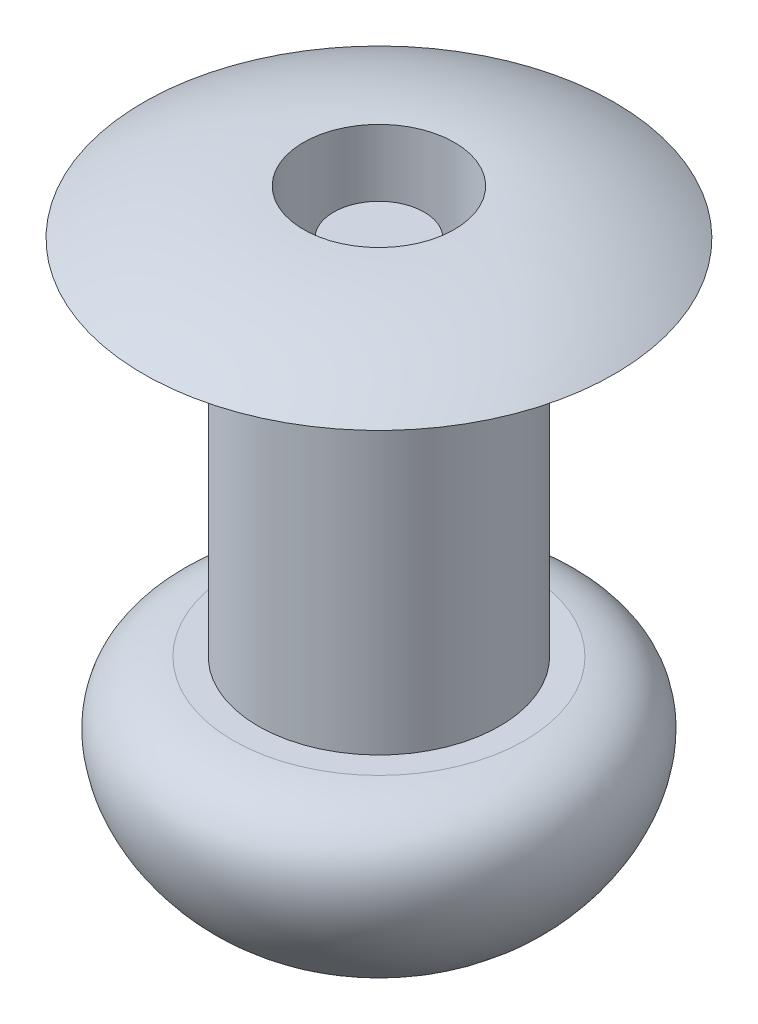
ISO-10303-21;
HEADER;
FILE_DESCRIPTION(('STEP AP214'),'2;1');
FILE_NAME('part.step','',(''),(''),'','','');
FILE_SCHEMA(('AUTOMOTIVE_DESIGN { 1 0 10303 214 1 1 1 1 }'));
ENDSEC;
DATA;
#1=APPLICATION_CONTEXT('core data for automotive mechanical design processes');
#2=APPLICATION_PROTOCOL_DEFINITION('international standard','automotive_design',2000,#1);
#3=PRODUCT_CONTEXT('',#1,'mechanical');
#4=PRODUCT('Part','Part','',(#3));
#5=PRODUCT_RELATED_PRODUCT_CATEGORY('part','',(#4));
#6=PRODUCT_DEFINITION_FORMATION('','',#4);
#7=PRODUCT_DEFINITION_CONTEXT('part definition',#1,'design');
#8=PRODUCT_DEFINITION('design','',#6,#7);
#9=PRODUCT_DEFINITION_SHAPE('','',#8);
#10=(LENGTH_UNIT() NAMED_UNIT(*) SI_UNIT(.MILLI.,.METRE.));
#11=(NAMED_UNIT(*) PLANE_ANGLE_UNIT() SI_UNIT($,.RADIAN.));
#12=(NAMED_UNIT(*) SI_UNIT($,.STERADIAN.) SOLID_ANGLE_UNIT());
#13=UNCERTAINTY_MEASURE_WITH_UNIT(LENGTH_MEASURE(1.E-05),#10,'distance_accuracy_value','');
#14=(GEOMETRIC_REPRESENTATION_CONTEXT(3) GLOBAL_UNCERTAINTY_ASSIGNED_CONTEXT((#13)) GLOBAL_UNIT_ASSIGNED_CONTEXT((#10,
#11,#12)) REPRESENTATION_CONTEXT('',''));
#15=CARTESIAN_POINT('',(0.,0.,0.));
#16=DIRECTION('',(0.,0.,1.));
#17=DIRECTION('',(1.,0.,0.));
#18=AXIS2_PLACEMENT_3D('',#15,#16,#17);
#19=CARTESIAN_POINT('',(0.,0.,0.));
#20=DIRECTION('',(0.,-1.,0.));
#21=DIRECTION('',(0.,0.,-1.));
#22=AXIS2_PLACEMENT_3D('',#19,#20,#21);
#23=PLANE('',#22);
#24=CARTESIAN_POINT('',(0.,0.,0.));
#25=DIRECTION('',(0.,-1.,0.));
#26=DIRECTION('',(0.,0.,-1.));
#27=AXIS2_PLACEMENT_3D('',#24,#25,#26);
#28=CIRCLE('',#27,0.75);
#29=CARTESIAN_POINT('',(0.,0.,-0.75));
#30=VERTEX_POINT('',#29);
#31=EDGE_CURVE('E11',#30,#30,#28,.T.);
#32=ORIENTED_EDGE('',*,*,#31,.F.);
#33=EDGE_LOOP('',(#32));
#34=FACE_BOUND('',#33,.T.);
#35=ADVANCED_FACE('F35',(#34),#23,.F.);
#36=CARTESIAN_POINT('',(0.,0.,0.));
#37=DIRECTION('',(0.,-1.,0.));
#38=DIRECTION('',(0.,0.,-1.));
#39=AXIS2_PLACEMENT_3D('',#36,#37,#38);
#40=CYLINDRICAL_SURFACE('',#39,0.75);
#41=CARTESIAN_POINT('',(0.,-6.,0.));
#42=DIRECTION('',(0.,-1.,0.));
#43=DIRECTION('',(0.,0.,-1.));
#44=AXIS2_PLACEMENT_3D('',#41,#42,#43);
#45=CIRCLE('',#44,0.749999999999999);
#46=CARTESIAN_POINT('',(0.,-6.,-0.749999999999999));
#47=VERTEX_POINT('',#46);
#48=EDGE_CURVE('E41',#47,#47,#45,.T.);
#49=ORIENTED_EDGE('',*,*,#48,.F.);
#50=EDGE_LOOP('',(#49));
#51=FACE_BOUND('',#50,.T.);
#52=ORIENTED_EDGE('',*,*,#31,.T.);
#53=EDGE_LOOP('',(#52));
#54=FACE_BOUND('',#53,.T.);
#55=ADVANCED_FACE('F80',(#51,#54),#40,.T.);
#56=CARTESIAN_POINT('',(0.,-6.,0.749999999999999));
#57=DIRECTION('',(0.,-1.,0.));
#58=DIRECTION('',(0.,0.,-1.));
#59=AXIS2_PLACEMENT_3D('',#56,#57,#58);
#60=PLANE('',#59);
#61=CARTESIAN_POINT('',(0.,-6.,0.));
#62=DIRECTION('',(0.,-1.,0.));
#63=DIRECTION('',(0.,0.,-1.));
#64=AXIS2_PLACEMENT_3D('',#61,#62,#63);
#65=CIRCLE('',#64,1.25);
#66=CARTESIAN_POINT('',(0.,-6.,-1.25));
#67=VERTEX_POINT('',#66);
#68=EDGE_CURVE('E73',#67,#67,#65,.T.);
#69=ORIENTED_EDGE('',*,*,#68,.F.);
#70=EDGE_LOOP('',(#69));
#71=FACE_BOUND('',#70,.T.);
#72=ORIENTED_EDGE('',*,*,#48,.T.);
#73=EDGE_LOOP('',(#72));
#74=FACE_BOUND('',#73,.T.);
#75=ADVANCED_FACE('F78',(#71,#74),#60,.F.);
#76=CARTESIAN_POINT('',(0.,0.,0.));
#77=DIRECTION('',(0.,-1.,0.));
#78=DIRECTION('',(0.,0.,-1.));
#79=AXIS2_PLACEMENT_3D('',#76,#77,#78);
#80=CYLINDRICAL_SURFACE('',#79,1.25);
#81=CARTESIAN_POINT('',(0.,0.75,0.));
#82=DIRECTION('',(0.,-1.,0.));
#83=DIRECTION('',(0.,0.,-1.));
#84=AXIS2_PLACEMENT_3D('',#81,#82,#83);
#85=CIRCLE('',#84,1.25);
#86=CARTESIAN_POINT('',(0.,0.75,-1.25));
#87=VERTEX_POINT('',#86);
#88=EDGE_CURVE('E70',#87,#87,#85,.T.);
#89=ORIENTED_EDGE('',*,*,#88,.F.);
#90=EDGE_LOOP('',(#89));
#91=FACE_BOUND('',#90,.T.);
#92=ORIENTED_EDGE('',*,*,#68,.T.);
#93=EDGE_LOOP('',(#92));
#94=FACE_BOUND('',#93,.T.);
#95=ADVANCED_FACE('F98',(#91,#94),#80,.F.);
#96=CARTESIAN_POINT('',(0.,-4.30666666666667,0.));
#97=DIRECTION('',(0.,-1.,0.));
#98=DIRECTION('',(0.,0.,-1.));
#99=AXIS2_PLACEMENT_3D('',#96,#97,#98);
#100=DEGENERATE_TOROIDAL_SURFACE('',#99,1.25,5.05666666666667,.T.);
#101=CARTESIAN_POINT('',(0.,0.,0.));
#102=DIRECTION('',(0.,-1.,0.));
#103=DIRECTION('',(0.,0.,-1.));
#104=AXIS2_PLACEMENT_3D('',#101,#102,#103);
#105=CIRCLE('',#104,3.9);
#106=CARTESIAN_POINT('',(0.,0.,-3.9));
#107=VERTEX_POINT('',#106);
#108=EDGE_CURVE('E67',#107,#107,#105,.T.);
#109=ORIENTED_EDGE('',*,*,#108,.F.);
#110=EDGE_LOOP('',(#109));
#111=FACE_BOUND('',#110,.T.);
#112=ORIENTED_EDGE('',*,*,#88,.T.);
#113=EDGE_LOOP('',(#112));
#114=FACE_BOUND('',#113,.T.);
#115=ADVANCED_FACE('F106',(#111,#114),#100,.T.);
#116=CARTESIAN_POINT('',(0.,0.,3.9));
#117=DIRECTION('',(0.,1.,0.));
#118=DIRECTION('',(0.,0.,1.));
#119=AXIS2_PLACEMENT_3D('',#116,#117,#118);
#120=PLANE('',#119);
#121=CARTESIAN_POINT('',(0.,0.,0.));
#122=DIRECTION('',(0.,-1.,0.));
#123=DIRECTION('',(0.,0.,-1.));
#124=AXIS2_PLACEMENT_3D('',#121,#122,#123);
#125=CIRCLE('',#124,2.);
#126=CARTESIAN_POINT('',(0.,0.,-2.));
#127=VERTEX_POINT('',#126);
#128=EDGE_CURVE('E64',#127,#127,#125,.T.);
#129=ORIENTED_EDGE('',*,*,#128,.F.);
#130=EDGE_LOOP('',(#129));
#131=FACE_BOUND('',#130,.T.);
#132=ORIENTED_EDGE('',*,*,#108,.T.);
#133=EDGE_LOOP('',(#132));
#134=FACE_BOUND('',#133,.T.);
#135=ADVANCED_FACE('F114',(#131,#134),#120,.F.);
#136=CARTESIAN_POINT('',(0.,0.,0.));
#137=DIRECTION('',(0.,-1.,0.));
#138=DIRECTION('',(0.,0.,-1.));
#139=AXIS2_PLACEMENT_3D('',#136,#137,#138);
#140=CYLINDRICAL_SURFACE('',#139,2.);
#141=CARTESIAN_POINT('',(0.,-6.,0.));
#142=DIRECTION('',(0.,-1.,0.));
#143=DIRECTION('',(0.,0.,-1.));
#144=AXIS2_PLACEMENT_3D('',#141,#142,#143);
#145=CIRCLE('',#144,2.);
#146=CARTESIAN_POINT('',(0.,-6.,-2.));
#147=VERTEX_POINT('',#146);
#148=EDGE_CURVE('E56',#147,#147,#145,.T.);
#149=ORIENTED_EDGE('',*,*,#148,.F.);
#150=EDGE_LOOP('',(#149));
#151=FACE_BOUND('',#150,.T.);
#152=ORIENTED_EDGE('',*,*,#128,.T.);
#153=EDGE_LOOP('',(#152));
#154=FACE_BOUND('',#153,.T.);
#155=ADVANCED_FACE('F122',(#151,#154),#140,.T.);
#156=CARTESIAN_POINT('',(0.,-6.,2.));
#157=DIRECTION('',(0.,-1.,0.));
#158=DIRECTION('',(0.,0.,-1.));
#159=AXIS2_PLACEMENT_3D('',#156,#157,#158);
#160=PLANE('',#159);
#161=CARTESIAN_POINT('',(0.,-6.,0.));
#162=DIRECTION('',(0.,-1.,0.));
#163=DIRECTION('',(0.,0.,-1.));
#164=AXIS2_PLACEMENT_3D('',#161,#162,#163);
#165=CIRCLE('',#164,2.4138917546613);
#166=CARTESIAN_POINT('',(0.,-6.,-2.4138917546613));
#167=VERTEX_POINT('',#166);
#168=EDGE_CURVE('E53',#167,#167,#165,.T.);
#169=ORIENTED_EDGE('',*,*,#168,.F.);
#170=EDGE_LOOP('',(#169));
#171=FACE_BOUND('',#170,.T.);
#172=ORIENTED_EDGE('',*,*,#148,.T.);
#173=EDGE_LOOP('',(#172));
#174=FACE_BOUND('',#173,.T.);
#175=ADVANCED_FACE('F130',(#171,#174),#160,.F.);
#176=CARTESIAN_POINT('',(0.,-6.,2.4138917546613));
#177=CARTESIAN_POINT('',(0.,-6.16329668629205,3.85855943689818));
#178=CARTESIAN_POINT('',(0.,-8.32298036215022,3.55835892789563));
#179=CARTESIAN_POINT('',(0.,-9.87194001622371,0.971318098259277));
#180=CARTESIAN_POINT('',(0.,-7.79203190958198,0.341145137497527));
#181=CARTESIAN_POINT('',(0.,-7.37819067059067,0.956030426512503));
#182=B_SPLINE_CURVE_WITH_KNOTS('',3,(#176,#177,#178,#179,#180,#181),.UNSPECIFIED.,.F.,.F.,(4,1,
1,4),(0.,0.454219308299973,0.705200671734253,1.),.UNSPECIFIED.);
#183=CARTESIAN_POINT('',(0.,0.,0.));
#184=DIRECTION('',(0.,-1.,0.));
#185=AXIS1_PLACEMENT('',#183,#184);
#186=SURFACE_OF_REVOLUTION('',#182,#185);
#187=CARTESIAN_POINT('',(0.,-7.37819067059067,0.));
#188=DIRECTION('',(0.,-1.,0.));
#189=DIRECTION('',(0.,0.,-1.));
#190=AXIS2_PLACEMENT_3D('',#187,#188,#189);
#191=CIRCLE('',#190,0.956030426512503);
#192=CARTESIAN_POINT('',(0.,-7.37819067059067,-0.956030426512503));
#193=VERTEX_POINT('',#192);
#194=EDGE_CURVE('E51',#193,#193,#191,.T.);
#195=ORIENTED_EDGE('',*,*,#194,.F.);
#196=EDGE_LOOP('',(#195));
#197=FACE_BOUND('',#196,.T.);
#198=ORIENTED_EDGE('',*,*,#168,.T.);
#199=EDGE_LOOP('',(#198));
#200=FACE_BOUND('',#199,.T.);
#201=ADVANCED_FACE('F47',(#197,#200),#186,.T.);
#202=CARTESIAN_POINT('',(0.,-6.75,0.));
#203=DIRECTION('',(1.,0.,0.));
#204=DIRECTION('',(0.,0.,1.));
#205=AXIS2_PLACEMENT_3D('',#202,#203,#204);
#206=ELLIPSE('',#205,1.75,0.749999999999999);
#207=TRIMMED_CURVE('',#206,(PARAMETER_VALUE(-1.5707963267949)),
(PARAMETER_VALUE(1.5707963267949)),.T.,.PARAMETER.);
#208=CARTESIAN_POINT('',(0.,0.,0.));
#209=DIRECTION('',(0.,-1.,0.));
#210=AXIS1_PLACEMENT('',#208,#209);
#211=SURFACE_OF_REVOLUTION('',#207,#210);
#212=CARTESIAN_POINT('',(0.,-7.5,0.));
#213=VERTEX_POINT('',#212);
#214=VERTEX_LOOP('',#213);
#215=FACE_BOUND('',#214,.T.);
#216=ORIENTED_EDGE('',*,*,#194,.T.);
#217=EDGE_LOOP('',(#216));
#218=FACE_BOUND('',#217,.T.);
#219=ADVANCED_FACE('F44',(#215,#218),#211,.T.);
#220=CLOSED_SHELL('',(#35,#55,#75,#95,#115,#135,#155,#175,#201,#219));
#221=MANIFOLD_SOLID_BREP('B2',#220);
#222=ADVANCED_BREP_SHAPE_REPRESENTATION('',(#18,#221),#14);
#223=SHAPE_DEFINITION_REPRESENTATION(#9,#222);
ENDSEC;
END-ISO-10303-21;
